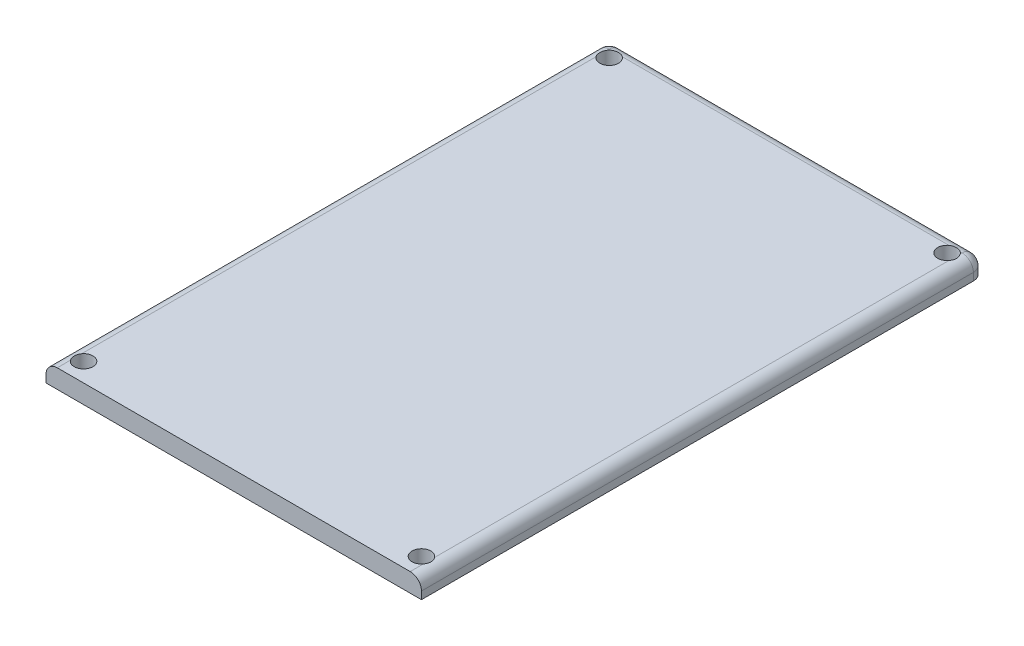
ISO-10303-21;
HEADER;
FILE_DESCRIPTION(('STEP AP214'),'2;1');
FILE_NAME('part.step','',(''),(''),'','','');
FILE_SCHEMA(('AUTOMOTIVE_DESIGN { 1 0 10303 214 1 1 1 1 }'));
ENDSEC;
DATA;
#1=APPLICATION_CONTEXT('core data for automotive mechanical design processes');
#2=APPLICATION_PROTOCOL_DEFINITION('international standard','automotive_design',2000,#1);
#3=PRODUCT_CONTEXT('',#1,'mechanical');
#4=PRODUCT('Part','Part','',(#3));
#5=PRODUCT_RELATED_PRODUCT_CATEGORY('part','',(#4));
#6=PRODUCT_DEFINITION_FORMATION('','',#4);
#7=PRODUCT_DEFINITION_CONTEXT('part definition',#1,'design');
#8=PRODUCT_DEFINITION('design','',#6,#7);
#9=PRODUCT_DEFINITION_SHAPE('','',#8);
#10=(LENGTH_UNIT() NAMED_UNIT(*) SI_UNIT(.MILLI.,.METRE.));
#11=(NAMED_UNIT(*) PLANE_ANGLE_UNIT() SI_UNIT($,.RADIAN.));
#12=(NAMED_UNIT(*) SI_UNIT($,.STERADIAN.) SOLID_ANGLE_UNIT());
#13=UNCERTAINTY_MEASURE_WITH_UNIT(LENGTH_MEASURE(1.E-05),#10,'distance_accuracy_value','');
#14=(GEOMETRIC_REPRESENTATION_CONTEXT(3) GLOBAL_UNCERTAINTY_ASSIGNED_CONTEXT((#13)) GLOBAL_UNIT_ASSIGNED_CONTEXT((#10,
#11,#12)) REPRESENTATION_CONTEXT('',''));
#15=CARTESIAN_POINT('',(0.,0.,0.));
#16=DIRECTION('',(0.,0.,1.));
#17=DIRECTION('',(1.,0.,0.));
#18=AXIS2_PLACEMENT_3D('',#15,#16,#17);
#19=CARTESIAN_POINT('',(0.,5.,0.));
#20=DIRECTION('',(0.,1.,0.));
#21=DIRECTION('',(0.,0.,1.));
#22=AXIS2_PLACEMENT_3D('',#19,#20,#21);
#23=PLANE('',#22);
#24=CARTESIAN_POINT('',(45.,5.,-70.));
#25=DIRECTION('',(0.,1.,0.));
#26=DIRECTION('',(0.,0.,-1.));
#27=AXIS2_PLACEMENT_3D('',#24,#25,#26);
#28=CIRCLE('',#27,2.5);
#29=CARTESIAN_POINT('',(43.5,5.,-72.));
#30=VERTEX_POINT('',#29);
#31=CARTESIAN_POINT('',(47.,5.,-68.5));
#32=VERTEX_POINT('',#31);
#33=EDGE_CURVE('E310',#30,#32,#28,.T.);
#34=ORIENTED_EDGE('',*,*,#33,.F.);
#35=DIRECTION('',(-1.,0.,0.));
#36=VECTOR('',#35,1.);
#37=CARTESIAN_POINT('',(-50.,5.,-72.));
#38=LINE('',#37,#36);
#39=CARTESIAN_POINT('',(-43.5,5.,-72.));
#40=VERTEX_POINT('',#39);
#41=EDGE_CURVE('E201',#30,#40,#38,.T.);
#42=ORIENTED_EDGE('',*,*,#41,.T.);
#43=CARTESIAN_POINT('',(-45.,5.,-70.));
#44=DIRECTION('',(0.,1.,0.));
#45=DIRECTION('',(0.,0.,1.));
#46=AXIS2_PLACEMENT_3D('',#43,#44,#45);
#47=CIRCLE('',#46,2.5);
#48=CARTESIAN_POINT('',(-47.,5.,-68.5));
#49=VERTEX_POINT('',#48);
#50=EDGE_CURVE('E331',#49,#40,#47,.T.);
#51=ORIENTED_EDGE('',*,*,#50,.F.);
#52=DIRECTION('',(0.,0.,1.));
#53=VECTOR('',#52,1.);
#54=CARTESIAN_POINT('',(-47.,5.,75.));
#55=LINE('',#54,#53);
#56=CARTESIAN_POINT('',(-47.,5.,68.4999999999999));
#57=VERTEX_POINT('',#56);
#58=EDGE_CURVE('E189',#49,#57,#55,.T.);
#59=ORIENTED_EDGE('',*,*,#58,.T.);
#60=CARTESIAN_POINT('',(-45.,5.,70.));
#61=DIRECTION('',(0.,1.,0.));
#62=DIRECTION('',(0.,0.,-1.));
#63=AXIS2_PLACEMENT_3D('',#60,#61,#62);
#64=CIRCLE('',#63,2.50000000000001);
#65=CARTESIAN_POINT('',(-47.,5.,71.5));
#66=VERTEX_POINT('',#65);
#67=EDGE_CURVE('E358',#66,#57,#64,.T.);
#68=ORIENTED_EDGE('',*,*,#67,.F.);
#69=DIRECTION('',(0.,0.,1.));
#70=VECTOR('',#69,1.);
#71=CARTESIAN_POINT('',(-47.,5.,75.));
#72=LINE('',#71,#70);
#73=CARTESIAN_POINT('',(-47.,5.,75.));
#74=VERTEX_POINT('',#73);
#75=EDGE_CURVE('E187',#66,#74,#72,.T.);
#76=ORIENTED_EDGE('',*,*,#75,.T.);
#77=DIRECTION('',(1.,0.,0.));
#78=VECTOR('',#77,1.);
#79=CARTESIAN_POINT('',(-50.,5.,75.));
#80=LINE('',#79,#78);
#81=CARTESIAN_POINT('',(47.,5.,75.));
#82=VERTEX_POINT('',#81);
#83=EDGE_CURVE('E164',#74,#82,#80,.T.);
#84=ORIENTED_EDGE('',*,*,#83,.T.);
#85=DIRECTION('',(0.,0.,-1.));
#86=VECTOR('',#85,1.);
#87=CARTESIAN_POINT('',(47.,5.,-75.));
#88=LINE('',#87,#86);
#89=CARTESIAN_POINT('',(47.,5.,71.5));
#90=VERTEX_POINT('',#89);
#91=EDGE_CURVE('E199',#82,#90,#88,.T.);
#92=ORIENTED_EDGE('',*,*,#91,.T.);
#93=CARTESIAN_POINT('',(45.,5.,70.));
#94=DIRECTION('',(0.,1.,0.));
#95=DIRECTION('',(0.,0.,1.));
#96=AXIS2_PLACEMENT_3D('',#93,#94,#95);
#97=CIRCLE('',#96,2.50000000000001);
#98=CARTESIAN_POINT('',(47.,5.,68.5));
#99=VERTEX_POINT('',#98);
#100=EDGE_CURVE('E366',#99,#90,#97,.T.);
#101=ORIENTED_EDGE('',*,*,#100,.F.);
#102=DIRECTION('',(0.,0.,-1.));
#103=VECTOR('',#102,1.);
#104=CARTESIAN_POINT('',(47.,5.,-75.));
#105=LINE('',#104,#103);
#106=EDGE_CURVE('E197',#99,#32,#105,.T.);
#107=ORIENTED_EDGE('',*,*,#106,.T.);
#108=EDGE_LOOP('',(#34,#42,#51,#59,#68,#76,#84,#92,#101,#107));
#109=FACE_BOUND('',#108,.T.);
#110=ADVANCED_FACE('F33',(#109),#23,.T.);
#111=DIRECTION('',(0.,0.,-1.));
#112=VECTOR('',#111,1.);
#113=CARTESIAN_POINT('',(47.,5.,-75.));
#114=LINE('',#113,#112);
#115=CARTESIAN_POINT('',(47.,5.,-71.5));
#116=VERTEX_POINT('',#115);
#117=CARTESIAN_POINT('',(47.,5.,-72.));
#118=VERTEX_POINT('',#117);
#119=EDGE_CURVE('E50',#116,#118,#114,.T.);
#120=ORIENTED_EDGE('',*,*,#119,.T.);
#121=DIRECTION('',(-1.,0.,0.));
#122=VECTOR('',#121,1.);
#123=CARTESIAN_POINT('',(-50.,5.,-72.));
#124=LINE('',#123,#122);
#125=CARTESIAN_POINT('',(46.5,5.,-72.));
#126=VERTEX_POINT('',#125);
#127=EDGE_CURVE('E195',#118,#126,#124,.T.);
#128=ORIENTED_EDGE('',*,*,#127,.T.);
#129=EDGE_CURVE('E319',#116,#126,#28,.T.);
#130=ORIENTED_EDGE('',*,*,#129,.F.);
#131=EDGE_LOOP('',(#120,#128,#130));
#132=FACE_BOUND('',#131,.T.);
#133=ADVANCED_FACE('F280',(#132),#23,.T.);
#134=CARTESIAN_POINT('',(50.,5.,-75.));
#135=DIRECTION('',(-1.,0.,0.));
#136=DIRECTION('',(0.,0.,1.));
#137=AXIS2_PLACEMENT_3D('',#134,#135,#136);
#138=PLANE('',#137);
#139=DIRECTION('',(0.,0.,-1.));
#140=VECTOR('',#139,1.);
#141=CARTESIAN_POINT('',(50.,0.,-75.));
#142=LINE('',#141,#140);
#143=CARTESIAN_POINT('',(50.,0.,75.));
#144=VERTEX_POINT('',#143);
#145=CARTESIAN_POINT('',(50.,0.,-72.));
#146=VERTEX_POINT('',#145);
#147=EDGE_CURVE('E163',#144,#146,#142,.T.);
#148=ORIENTED_EDGE('',*,*,#147,.T.);
#149=DIRECTION('',(0.,-1.,0.));
#150=VECTOR('',#149,1.);
#151=CARTESIAN_POINT('',(50.,5.,-72.));
#152=LINE('',#151,#150);
#153=CARTESIAN_POINT('',(50.,2.,-72.));
#154=VERTEX_POINT('',#153);
#155=EDGE_CURVE('E185',#146,#154,#152,.F.);
#156=ORIENTED_EDGE('',*,*,#155,.T.);
#157=DIRECTION('',(0.,0.,-1.));
#158=VECTOR('',#157,1.);
#159=CARTESIAN_POINT('',(50.,2.,75.));
#160=LINE('',#159,#158);
#161=CARTESIAN_POINT('',(50.,2.,75.));
#162=VERTEX_POINT('',#161);
#163=EDGE_CURVE('E183',#154,#162,#160,.F.);
#164=ORIENTED_EDGE('',*,*,#163,.T.);
#165=DIRECTION('',(0.,-1.,0.));
#166=VECTOR('',#165,1.);
#167=CARTESIAN_POINT('',(50.,5.,75.));
#168=LINE('',#167,#166);
#169=EDGE_CURVE('E150',#162,#144,#168,.T.);
#170=ORIENTED_EDGE('',*,*,#169,.T.);
#171=EDGE_LOOP('',(#148,#156,#164,#170));
#172=FACE_BOUND('',#171,.T.);
#173=ADVANCED_FACE('F291',(#172),#138,.F.);
#174=CARTESIAN_POINT('',(-50.,5.,-75.));
#175=DIRECTION('',(0.,0.,1.));
#176=DIRECTION('',(1.,0.,0.));
#177=AXIS2_PLACEMENT_3D('',#174,#175,#176);
#178=PLANE('',#177);
#179=DIRECTION('',(-1.,0.,0.));
#180=VECTOR('',#179,1.);
#181=CARTESIAN_POINT('',(-50.,0.,-75.));
#182=LINE('',#181,#180);
#183=CARTESIAN_POINT('',(47.,0.,-75.));
#184=VERTEX_POINT('',#183);
#185=CARTESIAN_POINT('',(-47.,0.,-75.));
#186=VERTEX_POINT('',#185);
#187=EDGE_CURVE('E159',#184,#186,#182,.T.);
#188=ORIENTED_EDGE('',*,*,#187,.T.);
#189=DIRECTION('',(0.,-1.,0.));
#190=VECTOR('',#189,1.);
#191=CARTESIAN_POINT('',(-47.,5.,-75.));
#192=LINE('',#191,#190);
#193=CARTESIAN_POINT('',(-47.,2.,-75.));
#194=VERTEX_POINT('',#193);
#195=EDGE_CURVE('E181',#186,#194,#192,.F.);
#196=ORIENTED_EDGE('',*,*,#195,.T.);
#197=DIRECTION('',(-1.,0.,0.));
#198=VECTOR('',#197,1.);
#199=CARTESIAN_POINT('',(50.,2.,-75.));
#200=LINE('',#199,#198);
#201=CARTESIAN_POINT('',(47.,2.,-75.));
#202=VERTEX_POINT('',#201);
#203=EDGE_CURVE('E177',#194,#202,#200,.F.);
#204=ORIENTED_EDGE('',*,*,#203,.T.);
#205=DIRECTION('',(0.,-1.,0.));
#206=VECTOR('',#205,1.);
#207=CARTESIAN_POINT('',(47.,5.,-75.));
#208=LINE('',#207,#206);
#209=EDGE_CURVE('E179',#202,#184,#208,.T.);
#210=ORIENTED_EDGE('',*,*,#209,.T.);
#211=EDGE_LOOP('',(#188,#196,#204,#210));
#212=FACE_BOUND('',#211,.T.);
#213=ADVANCED_FACE('F288',(#212),#178,.F.);
#214=CARTESIAN_POINT('',(-50.,5.,-75.));
#215=DIRECTION('',(1.,0.,0.));
#216=DIRECTION('',(0.,0.,-1.));
#217=AXIS2_PLACEMENT_3D('',#214,#215,#216);
#218=PLANE('',#217);
#219=DIRECTION('',(0.,0.,1.));
#220=VECTOR('',#219,1.);
#221=CARTESIAN_POINT('',(-50.,2.,-75.));
#222=LINE('',#221,#220);
#223=CARTESIAN_POINT('',(-50.,2.,75.));
#224=VERTEX_POINT('',#223);
#225=CARTESIAN_POINT('',(-50.,2.,-72.));
#226=VERTEX_POINT('',#225);
#227=EDGE_CURVE('E149',#224,#226,#222,.F.);
#228=ORIENTED_EDGE('',*,*,#227,.T.);
#229=DIRECTION('',(0.,-1.,0.));
#230=VECTOR('',#229,1.);
#231=CARTESIAN_POINT('',(-50.,5.,-72.));
#232=LINE('',#231,#230);
#233=CARTESIAN_POINT('',(-50.,0.,-72.));
#234=VERTEX_POINT('',#233);
#235=EDGE_CURVE('E157',#226,#234,#232,.T.);
#236=ORIENTED_EDGE('',*,*,#235,.T.);
#237=DIRECTION('',(0.,0.,1.));
#238=VECTOR('',#237,1.);
#239=CARTESIAN_POINT('',(-50.,0.,-75.));
#240=LINE('',#239,#238);
#241=CARTESIAN_POINT('',(-50.,0.,75.));
#242=VERTEX_POINT('',#241);
#243=EDGE_CURVE('E154',#234,#242,#240,.T.);
#244=ORIENTED_EDGE('',*,*,#243,.T.);
#245=DIRECTION('',(0.,-1.,0.));
#246=VECTOR('',#245,1.);
#247=CARTESIAN_POINT('',(-50.,5.,75.));
#248=LINE('',#247,#246);
#249=EDGE_CURVE('E137',#224,#242,#248,.T.);
#250=ORIENTED_EDGE('',*,*,#249,.F.);
#251=EDGE_LOOP('',(#228,#236,#244,#250));
#252=FACE_BOUND('',#251,.T.);
#253=ADVANCED_FACE('F155',(#252),#218,.F.);
#254=CARTESIAN_POINT('',(-50.,5.,75.));
#255=DIRECTION('',(0.,0.,-1.));
#256=DIRECTION('',(-1.,0.,0.));
#257=AXIS2_PLACEMENT_3D('',#254,#255,#256);
#258=PLANE('',#257);
#259=ORIENTED_EDGE('',*,*,#169,.F.);
#260=CARTESIAN_POINT('',(47.,2.,75.));
#261=DIRECTION('',(0.,0.,-1.));
#262=DIRECTION('',(-1.,0.,0.));
#263=AXIS2_PLACEMENT_3D('',#260,#261,#262);
#264=CIRCLE('',#263,3.);
#265=EDGE_CURVE('E42',#162,#82,#264,.F.);
#266=ORIENTED_EDGE('',*,*,#265,.T.);
#267=ORIENTED_EDGE('',*,*,#83,.F.);
#268=CARTESIAN_POINT('',(-47.,2.,75.));
#269=DIRECTION('',(0.,0.,-1.));
#270=DIRECTION('',(-1.,0.,0.));
#271=AXIS2_PLACEMENT_3D('',#268,#269,#270);
#272=CIRCLE('',#271,3.);
#273=EDGE_CURVE('E146',#74,#224,#272,.F.);
#274=ORIENTED_EDGE('',*,*,#273,.T.);
#275=ORIENTED_EDGE('',*,*,#249,.T.);
#276=DIRECTION('',(1.,0.,0.));
#277=VECTOR('',#276,1.);
#278=CARTESIAN_POINT('',(-50.,0.,75.));
#279=LINE('',#278,#277);
#280=EDGE_CURVE('E142',#242,#144,#279,.T.);
#281=ORIENTED_EDGE('',*,*,#280,.T.);
#282=EDGE_LOOP('',(#259,#266,#267,#274,#275,#281));
#283=FACE_BOUND('',#282,.T.);
#284=ADVANCED_FACE('F140',(#283),#258,.F.);
#285=CARTESIAN_POINT('',(-46.5,5.,-72.));
#286=VERTEX_POINT('',#285);
#287=CARTESIAN_POINT('',(-47.,5.,-71.5));
#288=VERTEX_POINT('',#287);
#289=EDGE_CURVE('E329',#286,#288,#47,.T.);
#290=ORIENTED_EDGE('',*,*,#289,.F.);
#291=DIRECTION('',(-1.,0.,0.));
#292=VECTOR('',#291,1.);
#293=CARTESIAN_POINT('',(-50.,5.,-72.));
#294=LINE('',#293,#292);
#295=CARTESIAN_POINT('',(-47.,5.,-72.));
#296=VERTEX_POINT('',#295);
#297=EDGE_CURVE('E58',#286,#296,#294,.T.);
#298=ORIENTED_EDGE('',*,*,#297,.T.);
#299=DIRECTION('',(0.,0.,1.));
#300=VECTOR('',#299,1.);
#301=CARTESIAN_POINT('',(-47.,5.,75.));
#302=LINE('',#301,#300);
#303=EDGE_CURVE('E191',#296,#288,#302,.T.);
#304=ORIENTED_EDGE('',*,*,#303,.T.);
#305=EDGE_LOOP('',(#290,#298,#304));
#306=FACE_BOUND('',#305,.T.);
#307=ADVANCED_FACE('F276',(#306),#23,.T.);
#308=CARTESIAN_POINT('',(0.,0.,0.));
#309=DIRECTION('',(0.,1.,0.));
#310=DIRECTION('',(0.,0.,1.));
#311=AXIS2_PLACEMENT_3D('',#308,#309,#310);
#312=PLANE('',#311);
#313=CARTESIAN_POINT('',(-45.,0.,70.));
#314=DIRECTION('',(0.,1.,0.));
#315=DIRECTION('',(0.,0.,-1.));
#316=AXIS2_PLACEMENT_3D('',#313,#314,#315);
#317=CIRCLE('',#316,2.50000000000001);
#318=CARTESIAN_POINT('',(-45.,0.,67.4999999999999));
#319=VERTEX_POINT('',#318);
#320=EDGE_CURVE('E361',#319,#319,#317,.T.);
#321=ORIENTED_EDGE('',*,*,#320,.T.);
#322=EDGE_LOOP('',(#321));
#323=FACE_BOUND('',#322,.T.);
#324=CARTESIAN_POINT('',(45.,0.,70.));
#325=DIRECTION('',(0.,1.,0.));
#326=DIRECTION('',(0.,0.,1.));
#327=AXIS2_PLACEMENT_3D('',#324,#325,#326);
#328=CIRCLE('',#327,2.50000000000001);
#329=CARTESIAN_POINT('',(45.,0.,72.5));
#330=VERTEX_POINT('',#329);
#331=EDGE_CURVE('E371',#330,#330,#328,.T.);
#332=ORIENTED_EDGE('',*,*,#331,.T.);
#333=EDGE_LOOP('',(#332));
#334=FACE_BOUND('',#333,.T.);
#335=CARTESIAN_POINT('',(45.,0.,-70.));
#336=DIRECTION('',(0.,1.,0.));
#337=DIRECTION('',(0.,0.,-1.));
#338=AXIS2_PLACEMENT_3D('',#335,#336,#337);
#339=CIRCLE('',#338,2.5);
#340=CARTESIAN_POINT('',(45.,0.,-72.5));
#341=VERTEX_POINT('',#340);
#342=EDGE_CURVE('E318',#341,#341,#339,.T.);
#343=ORIENTED_EDGE('',*,*,#342,.T.);
#344=EDGE_LOOP('',(#343));
#345=FACE_BOUND('',#344,.T.);
#346=CARTESIAN_POINT('',(-45.,0.,-70.));
#347=DIRECTION('',(0.,1.,0.));
#348=DIRECTION('',(0.,0.,1.));
#349=AXIS2_PLACEMENT_3D('',#346,#347,#348);
#350=CIRCLE('',#349,2.5);
#351=CARTESIAN_POINT('',(-45.,0.,-67.5));
#352=VERTEX_POINT('',#351);
#353=EDGE_CURVE('E332',#352,#352,#350,.T.);
#354=ORIENTED_EDGE('',*,*,#353,.T.);
#355=EDGE_LOOP('',(#354));
#356=FACE_BOUND('',#355,.T.);
#357=ORIENTED_EDGE('',*,*,#243,.F.);
#358=CARTESIAN_POINT('',(-47.,0.,-72.));
#359=DIRECTION('',(0.,1.,0.));
#360=DIRECTION('',(0.,0.,1.));
#361=AXIS2_PLACEMENT_3D('',#358,#359,#360);
#362=CIRCLE('',#361,3.);
#363=EDGE_CURVE('E175',#234,#186,#362,.F.);
#364=ORIENTED_EDGE('',*,*,#363,.T.);
#365=ORIENTED_EDGE('',*,*,#187,.F.);
#366=CARTESIAN_POINT('',(47.,0.,-72.));
#367=DIRECTION('',(0.,1.,0.));
#368=DIRECTION('',(0.,0.,1.));
#369=AXIS2_PLACEMENT_3D('',#366,#367,#368);
#370=CIRCLE('',#369,3.);
#371=EDGE_CURVE('E173',#184,#146,#370,.F.);
#372=ORIENTED_EDGE('',*,*,#371,.T.);
#373=ORIENTED_EDGE('',*,*,#147,.F.);
#374=ORIENTED_EDGE('',*,*,#280,.F.);
#375=EDGE_LOOP('',(#357,#364,#365,#372,#373,#374));
#376=FACE_BOUND('',#375,.T.);
#377=ADVANCED_FACE('F161',(#323,#334,#345,#356,#376),#312,.F.);
#378=CARTESIAN_POINT('',(-45.,0.,-70.));
#379=DIRECTION('',(0.,1.,0.));
#380=DIRECTION('',(0.,0.,1.));
#381=AXIS2_PLACEMENT_3D('',#378,#379,#380);
#382=CYLINDRICAL_SURFACE('',#381,2.5);
#383=ORIENTED_EDGE('',*,*,#353,.F.);
#384=EDGE_LOOP('',(#383));
#385=FACE_BOUND('',#384,.T.);
#386=ORIENTED_EDGE('',*,*,#50,.T.);
#387=CARTESIAN_POINT('',(-43.5,5.,-72.));
#388=CARTESIAN_POINT('',(-43.5560826329586,4.99999332193425,-72.0420704461217));
#389=CARTESIAN_POINT('',(-43.6139309591868,4.99911482948799,-72.0817619315182));
#390=CARTESIAN_POINT('',(-43.7327202941824,4.99616721008799,-72.1561314641283));
#391=CARTESIAN_POINT('',(-43.7936606057434,4.99409835046975,-72.1908106348321));
#392=CARTESIAN_POINT('',(-43.9182242373546,4.98932235877924,-72.2549209167581));
#393=CARTESIAN_POINT('',(-43.9818477065891,4.98661519117833,-72.2843517356934));
#394=CARTESIAN_POINT('',(-44.1113168960391,4.98104504226885,-72.3377666928871));
#395=CARTESIAN_POINT('',(-44.1771626958041,4.97818205538039,-72.3617506359338));
#396=CARTESIAN_POINT('',(-44.3773930257858,4.97001979214978,-72.4252677665956));
#397=CARTESIAN_POINT('',(-44.5145702799399,4.9651420135104,-72.4564175077951));
#398=CARTESIAN_POINT('',(-44.7921233399277,4.95889954464957,-72.4952818209267));
#399=CARTESIAN_POINT('',(-44.9324967599607,4.9575323154241,-72.5030133308165));
#400=CARTESIAN_POINT('',(-45.2118752843857,4.95889947246016,-72.49490195954));
#401=CARTESIAN_POINT('',(-45.3508837226405,4.96161417100129,-72.4791722381858));
#402=CARTESIAN_POINT('',(-45.6243109478129,4.96989699091219,-72.4248052662771));
#403=CARTESIAN_POINT('',(-45.7587277021726,4.97546635891138,-72.3861580065136));
#404=CARTESIAN_POINT('',(-45.9980484522702,4.98573760713422,-72.2951078574182));
#405=CARTESIAN_POINT('',(-46.10419803938,4.99043333550333,-72.245962252363));
#406=CARTESIAN_POINT('',(-46.2574351220355,4.99577955942664,-72.1615410896979));
#407=CARTESIAN_POINT('',(-46.3075012228484,4.99727853114346,-72.1316281765363));
#408=CARTESIAN_POINT('',(-46.4054482181154,4.99938758489703,-72.0683605533357));
#409=CARTESIAN_POINT('',(-46.453328483698,4.99999741266619,-72.0350048616878));
#410=CARTESIAN_POINT('',(-46.5,5.,-72.));
#411=B_SPLINE_CURVE_WITH_KNOTS('',3,(#387,#388,#389,#390,#391,#392,#393,#394,#395,#396,#397,
#398,#399,#400,#401,#402,#403,#404,#405,#406,#407,#408,#409,#410),.UNSPECIFIED.,.F.,.F.,(4,2,2,
2,2,2,2,2,2,2,2,4),(0.,0.210235486583612,0.420423776401103,0.630623768202679,0.840831292217669,
1.26091362427921,1.68069204620185,2.09845230086932,2.51639514637855,2.86639901042636,
3.04128920196869,3.2162293968773),.UNSPECIFIED.);
#412=EDGE_CURVE('E243',#40,#286,#411,.T.);
#413=ORIENTED_EDGE('',*,*,#412,.T.);
#414=ORIENTED_EDGE('',*,*,#289,.T.);
#415=CARTESIAN_POINT('',(-47.,5.,-71.5));
#416=CARTESIAN_POINT('',(-47.0420704461217,4.99999332193426,-71.4439173670413));
#417=CARTESIAN_POINT('',(-47.0817619315182,4.99911482948799,-71.3860690408132));
#418=CARTESIAN_POINT('',(-47.1561314641283,4.99616721008799,-71.2672797058176));
#419=CARTESIAN_POINT('',(-47.1908106348321,4.99409835046975,-71.2063393942565));
#420=CARTESIAN_POINT('',(-47.2549209167581,4.98932235877924,-71.0817757626454));
#421=CARTESIAN_POINT('',(-47.2843517356934,4.98661519117833,-71.0181522934109));
#422=CARTESIAN_POINT('',(-47.3377666928871,4.98104504226884,-70.8886831039608));
#423=CARTESIAN_POINT('',(-47.3617506359338,4.97818205538039,-70.8228373041958));
#424=CARTESIAN_POINT('',(-47.4252677665956,4.97001979214978,-70.6226069742141));
#425=CARTESIAN_POINT('',(-47.4564175077952,4.9651420135104,-70.4854297200601));
#426=CARTESIAN_POINT('',(-47.4952818209267,4.95889954464957,-70.2078766600722));
#427=CARTESIAN_POINT('',(-47.5030133308165,4.95753231542409,-70.0675032400392));
#428=CARTESIAN_POINT('',(-47.4949019595401,4.95889947246016,-69.7881247156142));
#429=CARTESIAN_POINT('',(-47.4791722381858,4.96161417100129,-69.6491162773595));
#430=CARTESIAN_POINT('',(-47.4248052662771,4.96989699091218,-69.3756890521871));
#431=CARTESIAN_POINT('',(-47.3861580065136,4.97546635891138,-69.2412722978274));
#432=CARTESIAN_POINT('',(-47.2951078574183,4.98573760713422,-69.0019515477297));
#433=CARTESIAN_POINT('',(-47.245962252363,4.99043333550333,-68.8958019606199));
#434=CARTESIAN_POINT('',(-47.161541089698,4.99577955942664,-68.7425648779645));
#435=CARTESIAN_POINT('',(-47.1316281765363,4.99727853114346,-68.6924987771515));
#436=CARTESIAN_POINT('',(-47.0683605533357,4.99938758489702,-68.5945517818846));
#437=CARTESIAN_POINT('',(-47.0350048616878,4.99999741266619,-68.546671516302));
#438=CARTESIAN_POINT('',(-47.,5.,-68.5));
#439=B_SPLINE_CURVE_WITH_KNOTS('',3,(#415,#416,#417,#418,#419,#420,#421,#422,#423,#424,#425,
#426,#427,#428,#429,#430,#431,#432,#433,#434,#435,#436,#437,#438),.UNSPECIFIED.,.F.,.F.,(4,2,2,
2,2,2,2,2,2,2,2,4),(0.,0.210235486583606,0.420423776401103,0.630623768202701,0.840831292217681,
1.26091362427921,1.68069204620187,2.09845230086934,2.51639514637854,2.86639901042637,
3.0412892019687,3.21622939687733),.UNSPECIFIED.);
#440=EDGE_CURVE('E267',#288,#49,#439,.T.);
#441=ORIENTED_EDGE('',*,*,#440,.T.);
#442=EDGE_LOOP('',(#386,#413,#414,#441));
#443=FACE_BOUND('',#442,.T.);
#444=ADVANCED_FACE('F225',(#385,#443),#382,.F.);
#445=CARTESIAN_POINT('',(45.,0.,-70.));
#446=DIRECTION('',(0.,1.,0.));
#447=DIRECTION('',(0.,0.,1.));
#448=AXIS2_PLACEMENT_3D('',#445,#446,#447);
#449=CYLINDRICAL_SURFACE('',#448,2.5);
#450=ORIENTED_EDGE('',*,*,#342,.F.);
#451=EDGE_LOOP('',(#450));
#452=FACE_BOUND('',#451,.T.);
#453=ORIENTED_EDGE('',*,*,#129,.T.);
#454=CARTESIAN_POINT('',(46.5,5.,-72.));
#455=CARTESIAN_POINT('',(46.4439173670414,4.99999332193425,-72.0420704461217));
#456=CARTESIAN_POINT('',(46.3860690408132,4.99911482948799,-72.0817619315182));
#457=CARTESIAN_POINT('',(46.2672797058176,4.99616721008799,-72.1561314641283));
#458=CARTESIAN_POINT('',(46.2063393942566,4.99409835046975,-72.1908106348321));
#459=CARTESIAN_POINT('',(46.0817757626454,4.98932235877924,-72.2549209167581));
#460=CARTESIAN_POINT('',(46.0181522934109,4.98661519117833,-72.2843517356934));
#461=CARTESIAN_POINT('',(45.8886831039609,4.98104504226884,-72.3377666928871));
#462=CARTESIAN_POINT('',(45.8228373041959,4.97818205538039,-72.3617506359338));
#463=CARTESIAN_POINT('',(45.6226069742142,4.97001979214978,-72.4252677665956));
#464=CARTESIAN_POINT('',(45.4854297200601,4.9651420135104,-72.4564175077952));
#465=CARTESIAN_POINT('',(45.2078766600722,4.95889954464957,-72.4952818209267));
#466=CARTESIAN_POINT('',(45.0675032400393,4.95753231542409,-72.5030133308165));
#467=CARTESIAN_POINT('',(44.7881247156142,4.95889947246016,-72.49490195954));
#468=CARTESIAN_POINT('',(44.6491162773595,4.96161417100129,-72.4791722381858));
#469=CARTESIAN_POINT('',(44.3756890521871,4.96989699091218,-72.4248052662771));
#470=CARTESIAN_POINT('',(44.2412722978274,4.97546635891138,-72.3861580065136));
#471=CARTESIAN_POINT('',(44.0019515477297,4.98573760713422,-72.2951078574182));
#472=CARTESIAN_POINT('',(43.8958019606199,4.99043333550333,-72.245962252363));
#473=CARTESIAN_POINT('',(43.7425648779645,4.99577955942664,-72.161541089698));
#474=CARTESIAN_POINT('',(43.6924987771515,4.99727853114346,-72.1316281765363));
#475=CARTESIAN_POINT('',(43.5945517818846,4.99938758489702,-72.0683605533357));
#476=CARTESIAN_POINT('',(43.546671516302,4.99999741266619,-72.0350048616878));
#477=CARTESIAN_POINT('',(43.5,5.,-72.));
#478=B_SPLINE_CURVE_WITH_KNOTS('',3,(#454,#455,#456,#457,#458,#459,#460,#461,#462,#463,#464,
#465,#466,#467,#468,#469,#470,#471,#472,#473,#474,#475,#476,#477),.UNSPECIFIED.,.F.,.F.,(4,2,2,
2,2,2,2,2,2,2,2,4),(0.,0.210235486583625,0.420423776401103,0.630623768202686,0.840831292217674,
1.26091362427923,1.68069204620185,2.09845230086934,2.51639514637855,2.86639901042638,
3.04128920196872,3.21622939687734),.UNSPECIFIED.);
#479=EDGE_CURVE('E210',#126,#30,#478,.T.);
#480=ORIENTED_EDGE('',*,*,#479,.T.);
#481=ORIENTED_EDGE('',*,*,#33,.T.);
#482=CARTESIAN_POINT('',(47.,5.,-68.5));
#483=CARTESIAN_POINT('',(47.0420704461217,4.99999332193426,-68.5560826329586));
#484=CARTESIAN_POINT('',(47.0817619315182,4.99911482948799,-68.6139309591867));
#485=CARTESIAN_POINT('',(47.1561314641283,4.99616721008799,-68.7327202941824));
#486=CARTESIAN_POINT('',(47.1908106348321,4.99409835046975,-68.7936606057434));
#487=CARTESIAN_POINT('',(47.2549209167581,4.98932235877924,-68.9182242373545));
#488=CARTESIAN_POINT('',(47.2843517356934,4.98661519117833,-68.9818477065891));
#489=CARTESIAN_POINT('',(47.3377666928871,4.98104504226884,-69.1113168960391));
#490=CARTESIAN_POINT('',(47.3617506359338,4.97818205538039,-69.1771626958041));
#491=CARTESIAN_POINT('',(47.4252677665956,4.97001979214978,-69.3773930257858));
#492=CARTESIAN_POINT('',(47.4564175077952,4.9651420135104,-69.5145702799399));
#493=CARTESIAN_POINT('',(47.4952818209267,4.95889954464957,-69.7921233399277));
#494=CARTESIAN_POINT('',(47.5030133308165,4.9575323154241,-69.9324967599607));
#495=CARTESIAN_POINT('',(47.4949019595401,4.95889947246016,-70.2118752843857));
#496=CARTESIAN_POINT('',(47.4791722381858,4.96161417100129,-70.3508837226405));
#497=CARTESIAN_POINT('',(47.4248052662771,4.96989699091219,-70.6243109478129));
#498=CARTESIAN_POINT('',(47.3861580065136,4.97546635891138,-70.7587277021726));
#499=CARTESIAN_POINT('',(47.2951078574182,4.98573760713422,-70.9980484522702));
#500=CARTESIAN_POINT('',(47.245962252363,4.99043333550333,-71.10419803938));
#501=CARTESIAN_POINT('',(47.161541089698,4.99577955942664,-71.2574351220354));
#502=CARTESIAN_POINT('',(47.1316281765363,4.99727853114346,-71.3075012228484));
#503=CARTESIAN_POINT('',(47.0683605533357,4.99938758489703,-71.4054482181154));
#504=CARTESIAN_POINT('',(47.0350048616878,4.99999741266619,-71.4533284836979));
#505=CARTESIAN_POINT('',(47.,5.,-71.5));
#506=B_SPLINE_CURVE_WITH_KNOTS('',3,(#482,#483,#484,#485,#486,#487,#488,#489,#490,#491,#492,
#493,#494,#495,#496,#497,#498,#499,#500,#501,#502,#503,#504,#505),.UNSPECIFIED.,.F.,.F.,(4,2,2,
2,2,2,2,2,2,2,2,4),(0.,0.210235486583606,0.420423776401103,0.630623768202698,0.840831292217678,
1.26091362427921,1.68069204620186,2.09845230086932,2.51639514637855,2.86639901042635,
3.04128920196869,3.2162293968773),.UNSPECIFIED.);
#507=EDGE_CURVE('E203',#32,#116,#506,.T.);
#508=ORIENTED_EDGE('',*,*,#507,.T.);
#509=EDGE_LOOP('',(#453,#480,#481,#508));
#510=FACE_BOUND('',#509,.T.);
#511=ADVANCED_FACE('F220',(#452,#510),#449,.F.);
#512=CARTESIAN_POINT('',(45.,0.,70.));
#513=DIRECTION('',(0.,1.,0.));
#514=DIRECTION('',(0.,0.,1.));
#515=AXIS2_PLACEMENT_3D('',#512,#513,#514);
#516=CYLINDRICAL_SURFACE('',#515,2.50000000000001);
#517=ORIENTED_EDGE('',*,*,#331,.F.);
#518=EDGE_LOOP('',(#517));
#519=FACE_BOUND('',#518,.T.);
#520=ORIENTED_EDGE('',*,*,#100,.T.);
#521=CARTESIAN_POINT('',(47.,5.,71.5));
#522=CARTESIAN_POINT('',(47.0420704461217,4.99999332193425,71.4439173670413));
#523=CARTESIAN_POINT('',(47.0817619315183,4.99911482948799,71.3860690408132));
#524=CARTESIAN_POINT('',(47.1561314641283,4.99616721008799,71.2672797058176));
#525=CARTESIAN_POINT('',(47.1908106348321,4.99409835046975,71.2063393942565));
#526=CARTESIAN_POINT('',(47.2549209167582,4.98932235877924,71.0817757626454));
#527=CARTESIAN_POINT('',(47.2843517356934,4.98661519117833,71.0181522934109));
#528=CARTESIAN_POINT('',(47.3377666928871,4.98104504226884,70.8886831039609));
#529=CARTESIAN_POINT('',(47.3617506359338,4.97818205538039,70.8228373041959));
#530=CARTESIAN_POINT('',(47.4252677665956,4.97001979214978,70.6226069742141));
#531=CARTESIAN_POINT('',(47.4564175077952,4.9651420135104,70.4854297200601));
#532=CARTESIAN_POINT('',(47.4952818209267,4.95889954464957,70.2078766600722));
#533=CARTESIAN_POINT('',(47.5030133308165,4.95753231542409,70.0675032400392));
#534=CARTESIAN_POINT('',(47.4949019595401,4.95889947246016,69.7881247156142));
#535=CARTESIAN_POINT('',(47.4791722381858,4.96161417100129,69.6491162773595));
#536=CARTESIAN_POINT('',(47.4248052662771,4.96989699091218,69.3756890521871));
#537=CARTESIAN_POINT('',(47.3861580065136,4.97546635891138,69.2412722978274));
#538=CARTESIAN_POINT('',(47.2951078574183,4.98573760713422,69.0019515477297));
#539=CARTESIAN_POINT('',(47.245962252363,4.99043333550333,68.8958019606199));
#540=CARTESIAN_POINT('',(47.161541089698,4.99577955942664,68.7425648779645));
#541=CARTESIAN_POINT('',(47.1316281765363,4.99727853114346,68.6924987771515));
#542=CARTESIAN_POINT('',(47.0683605533357,4.99938758489702,68.5945517818846));
#543=CARTESIAN_POINT('',(47.0350048616879,4.99999741266619,68.546671516302));
#544=CARTESIAN_POINT('',(47.,5.,68.5));
#545=B_SPLINE_CURVE_WITH_KNOTS('',3,(#521,#522,#523,#524,#525,#526,#527,#528,#529,#530,#531,
#532,#533,#534,#535,#536,#537,#538,#539,#540,#541,#542,#543,#544),.UNSPECIFIED.,.F.,.F.,(4,2,2,
2,2,2,2,2,2,2,2,4),(0.,0.210235486583621,0.420423776401103,0.630623768202686,0.840831292217678,
1.26091362427924,1.68069204620186,2.09845230086935,2.51639514637855,2.86639901042637,
3.04128920196873,3.21622939687733),.UNSPECIFIED.);
#546=EDGE_CURVE('E236',#90,#99,#545,.T.);
#547=ORIENTED_EDGE('',*,*,#546,.T.);
#548=EDGE_LOOP('',(#520,#547));
#549=FACE_BOUND('',#548,.T.);
#550=ADVANCED_FACE('F224',(#519,#549),#516,.F.);
#551=CARTESIAN_POINT('',(-45.,0.,70.));
#552=DIRECTION('',(0.,1.,0.));
#553=DIRECTION('',(0.,0.,1.));
#554=AXIS2_PLACEMENT_3D('',#551,#552,#553);
#555=CYLINDRICAL_SURFACE('',#554,2.50000000000001);
#556=ORIENTED_EDGE('',*,*,#320,.F.);
#557=EDGE_LOOP('',(#556));
#558=FACE_BOUND('',#557,.T.);
#559=ORIENTED_EDGE('',*,*,#67,.T.);
#560=CARTESIAN_POINT('',(-47.,5.,68.4999999999999));
#561=CARTESIAN_POINT('',(-47.0420704461217,4.99999332193425,68.5560826329586));
#562=CARTESIAN_POINT('',(-47.0817619315182,4.99911482948799,68.6139309591867));
#563=CARTESIAN_POINT('',(-47.1561314641283,4.99616721008799,68.7327202941823));
#564=CARTESIAN_POINT('',(-47.1908106348321,4.99409835046975,68.7936606057434));
#565=CARTESIAN_POINT('',(-47.2549209167581,4.98932235877924,68.9182242373545));
#566=CARTESIAN_POINT('',(-47.2843517356934,4.98661519117833,68.981847706589));
#567=CARTESIAN_POINT('',(-47.3377666928871,4.98104504226884,69.1113168960391));
#568=CARTESIAN_POINT('',(-47.3617506359338,4.97818205538038,69.1771626958041));
#569=CARTESIAN_POINT('',(-47.4252677665956,4.97001979214978,69.3773930257858));
#570=CARTESIAN_POINT('',(-47.4564175077952,4.96514201351039,69.5145702799398));
#571=CARTESIAN_POINT('',(-47.4952818209267,4.95889954464957,69.7921233399277));
#572=CARTESIAN_POINT('',(-47.5030133308165,4.95753231542409,69.9324967599607));
#573=CARTESIAN_POINT('',(-47.4949019595401,4.95889947246016,70.2118752843857));
#574=CARTESIAN_POINT('',(-47.4791722381858,4.96161417100129,70.3508837226404));
#575=CARTESIAN_POINT('',(-47.4248052662771,4.96989699091218,70.6243109478128));
#576=CARTESIAN_POINT('',(-47.3861580065136,4.97546635891138,70.7587277021726));
#577=CARTESIAN_POINT('',(-47.2951078574183,4.98573760713422,70.9980484522702));
#578=CARTESIAN_POINT('',(-47.245962252363,4.99043333550333,71.10419803938));
#579=CARTESIAN_POINT('',(-47.161541089698,4.99577955942664,71.2574351220354));
#580=CARTESIAN_POINT('',(-47.1316281765363,4.99727853114346,71.3075012228484));
#581=CARTESIAN_POINT('',(-47.0683605533357,4.99938758489703,71.4054482181154));
#582=CARTESIAN_POINT('',(-47.0350048616878,4.99999741266619,71.453328483698));
#583=CARTESIAN_POINT('',(-47.,5.,71.5));
#584=B_SPLINE_CURVE_WITH_KNOTS('',3,(#560,#561,#562,#563,#564,#565,#566,#567,#568,#569,#570,
#571,#572,#573,#574,#575,#576,#577,#578,#579,#580,#581,#582,#583),.UNSPECIFIED.,.F.,.F.,(4,2,2,
2,2,2,2,2,2,2,2,4),(0.,0.21023548658361,0.42042377640111,0.630623768202709,0.840831292217688,
1.2609136242792,1.68069204620188,2.09845230086933,2.51639514637858,2.86639901042642,
3.04128920196878,3.2162293968774),.UNSPECIFIED.);
#585=EDGE_CURVE('E11',#57,#66,#584,.T.);
#586=ORIENTED_EDGE('',*,*,#585,.T.);
#587=EDGE_LOOP('',(#559,#586));
#588=FACE_BOUND('',#587,.T.);
#589=ADVANCED_FACE('F231',(#558,#588),#555,.F.);
#590=CARTESIAN_POINT('',(47.,5.,-72.));
#591=DIRECTION('',(0.,-1.,0.));
#592=DIRECTION('',(0.,0.,-1.));
#593=AXIS2_PLACEMENT_3D('',#590,#591,#592);
#594=CYLINDRICAL_SURFACE('',#593,3.);
#595=ORIENTED_EDGE('',*,*,#371,.F.);
#596=ORIENTED_EDGE('',*,*,#209,.F.);
#597=CARTESIAN_POINT('',(47.,2.,-72.));
#598=DIRECTION('',(0.,1.,0.));
#599=DIRECTION('',(0.,0.,1.));
#600=AXIS2_PLACEMENT_3D('',#597,#598,#599);
#601=CIRCLE('',#600,3.);
#602=EDGE_CURVE('E37',#154,#202,#601,.T.);
#603=ORIENTED_EDGE('',*,*,#602,.F.);
#604=ORIENTED_EDGE('',*,*,#155,.F.);
#605=EDGE_LOOP('',(#595,#596,#603,#604));
#606=FACE_BOUND('',#605,.T.);
#607=ADVANCED_FACE('F35',(#606),#594,.T.);
#608=CARTESIAN_POINT('',(47.,2.,0.));
#609=DIRECTION('',(0.,0.,1.));
#610=DIRECTION('',(1.,0.,0.));
#611=AXIS2_PLACEMENT_3D('',#608,#609,#610);
#612=CYLINDRICAL_SURFACE('',#611,3.);
#613=ORIENTED_EDGE('',*,*,#265,.F.);
#614=ORIENTED_EDGE('',*,*,#163,.F.);
#615=CARTESIAN_POINT('',(47.,2.,-72.));
#616=DIRECTION('',(0.,0.,-1.));
#617=DIRECTION('',(-1.,0.,0.));
#618=AXIS2_PLACEMENT_3D('',#615,#616,#617);
#619=CIRCLE('',#618,3.);
#620=EDGE_CURVE('E353',#118,#154,#619,.T.);
#621=ORIENTED_EDGE('',*,*,#620,.F.);
#622=ORIENTED_EDGE('',*,*,#119,.F.);
#623=ORIENTED_EDGE('',*,*,#507,.F.);
#624=ORIENTED_EDGE('',*,*,#106,.F.);
#625=ORIENTED_EDGE('',*,*,#546,.F.);
#626=ORIENTED_EDGE('',*,*,#91,.F.);
#627=EDGE_LOOP('',(#613,#614,#621,#622,#623,#624,#625,#626));
#628=FACE_BOUND('',#627,.T.);
#629=ADVANCED_FACE('F217',(#628),#612,.T.);
#630=CARTESIAN_POINT('',(47.,2.,-72.));
#631=DIRECTION('',(1.,0.,0.));
#632=DIRECTION('',(0.,0.,-1.));
#633=AXIS2_PLACEMENT_3D('',#630,#631,#632);
#634=SPHERICAL_SURFACE('',#633,3.);
#635=ORIENTED_EDGE('',*,*,#620,.T.);
#636=ORIENTED_EDGE('',*,*,#602,.T.);
#637=CARTESIAN_POINT('',(47.,2.,-72.));
#638=DIRECTION('',(1.,0.,0.));
#639=DIRECTION('',(0.,0.,-1.));
#640=AXIS2_PLACEMENT_3D('',#637,#638,#639);
#641=CIRCLE('',#640,3.);
#642=EDGE_CURVE('E350',#118,#202,#641,.F.);
#643=ORIENTED_EDGE('',*,*,#642,.F.);
#644=EDGE_LOOP('',(#635,#636,#643));
#645=FACE_BOUND('',#644,.T.);
#646=ADVANCED_FACE('F382',(#645),#634,.T.);
#647=CARTESIAN_POINT('',(0.,2.,-72.));
#648=DIRECTION('',(1.,0.,0.));
#649=DIRECTION('',(0.,0.,-1.));
#650=AXIS2_PLACEMENT_3D('',#647,#648,#649);
#651=CYLINDRICAL_SURFACE('',#650,3.);
#652=ORIENTED_EDGE('',*,*,#642,.T.);
#653=ORIENTED_EDGE('',*,*,#203,.F.);
#654=CARTESIAN_POINT('',(-47.,2.,-72.));
#655=DIRECTION('',(-1.,0.,0.));
#656=DIRECTION('',(0.,0.,1.));
#657=AXIS2_PLACEMENT_3D('',#654,#655,#656);
#658=CIRCLE('',#657,3.);
#659=EDGE_CURVE('E348',#296,#194,#658,.T.);
#660=ORIENTED_EDGE('',*,*,#659,.F.);
#661=ORIENTED_EDGE('',*,*,#297,.F.);
#662=ORIENTED_EDGE('',*,*,#412,.F.);
#663=ORIENTED_EDGE('',*,*,#41,.F.);
#664=ORIENTED_EDGE('',*,*,#479,.F.);
#665=ORIENTED_EDGE('',*,*,#127,.F.);
#666=EDGE_LOOP('',(#652,#653,#660,#661,#662,#663,#664,#665));
#667=FACE_BOUND('',#666,.T.);
#668=ADVANCED_FACE('F262',(#667),#651,.T.);
#669=CARTESIAN_POINT('',(-47.,2.,0.));
#670=DIRECTION('',(0.,0.,-1.));
#671=DIRECTION('',(-1.,0.,0.));
#672=AXIS2_PLACEMENT_3D('',#669,#670,#671);
#673=CYLINDRICAL_SURFACE('',#672,3.);
#674=ORIENTED_EDGE('',*,*,#440,.F.);
#675=ORIENTED_EDGE('',*,*,#303,.F.);
#676=CARTESIAN_POINT('',(-47.,2.,-72.));
#677=DIRECTION('',(0.,0.,-1.));
#678=DIRECTION('',(-1.,0.,0.));
#679=AXIS2_PLACEMENT_3D('',#676,#677,#678);
#680=CIRCLE('',#679,3.);
#681=EDGE_CURVE('E347',#226,#296,#680,.T.);
#682=ORIENTED_EDGE('',*,*,#681,.F.);
#683=ORIENTED_EDGE('',*,*,#227,.F.);
#684=ORIENTED_EDGE('',*,*,#273,.F.);
#685=ORIENTED_EDGE('',*,*,#75,.F.);
#686=ORIENTED_EDGE('',*,*,#585,.F.);
#687=ORIENTED_EDGE('',*,*,#58,.F.);
#688=EDGE_LOOP('',(#674,#675,#682,#683,#684,#685,#686,#687));
#689=FACE_BOUND('',#688,.T.);
#690=ADVANCED_FACE('F257',(#689),#673,.T.);
#691=CARTESIAN_POINT('',(-47.,2.,-72.));
#692=DIRECTION('',(0.,1.,0.));
#693=DIRECTION('',(0.,0.,1.));
#694=AXIS2_PLACEMENT_3D('',#691,#692,#693);
#695=SPHERICAL_SURFACE('',#694,3.);
#696=ORIENTED_EDGE('',*,*,#681,.T.);
#697=ORIENTED_EDGE('',*,*,#659,.T.);
#698=CARTESIAN_POINT('',(-47.,2.,-72.));
#699=DIRECTION('',(0.,1.,0.));
#700=DIRECTION('',(0.,0.,1.));
#701=AXIS2_PLACEMENT_3D('',#698,#699,#700);
#702=CIRCLE('',#701,3.);
#703=EDGE_CURVE('E255',#226,#194,#702,.F.);
#704=ORIENTED_EDGE('',*,*,#703,.F.);
#705=EDGE_LOOP('',(#696,#697,#704));
#706=FACE_BOUND('',#705,.T.);
#707=ADVANCED_FACE('F261',(#706),#695,.T.);
#708=CARTESIAN_POINT('',(-47.,5.,-72.));
#709=DIRECTION('',(0.,-1.,0.));
#710=DIRECTION('',(0.,0.,-1.));
#711=AXIS2_PLACEMENT_3D('',#708,#709,#710);
#712=CYLINDRICAL_SURFACE('',#711,3.);
#713=ORIENTED_EDGE('',*,*,#703,.T.);
#714=ORIENTED_EDGE('',*,*,#195,.F.);
#715=ORIENTED_EDGE('',*,*,#363,.F.);
#716=ORIENTED_EDGE('',*,*,#235,.F.);
#717=EDGE_LOOP('',(#713,#714,#715,#716));
#718=FACE_BOUND('',#717,.T.);
#719=ADVANCED_FACE('F295',(#718),#712,.T.);
#720=CLOSED_SHELL('',(#110,#133,#173,#213,#253,#284,#307,#377,#444,#511,#550,#589,#607,#629,
#646,#668,#690,#707,#719));
#721=MANIFOLD_SOLID_BREP('B2',#720);
#722=ADVANCED_BREP_SHAPE_REPRESENTATION('',(#18,#721),#14);
#723=SHAPE_DEFINITION_REPRESENTATION(#9,#722);
ENDSEC;
END-ISO-10303-21;
